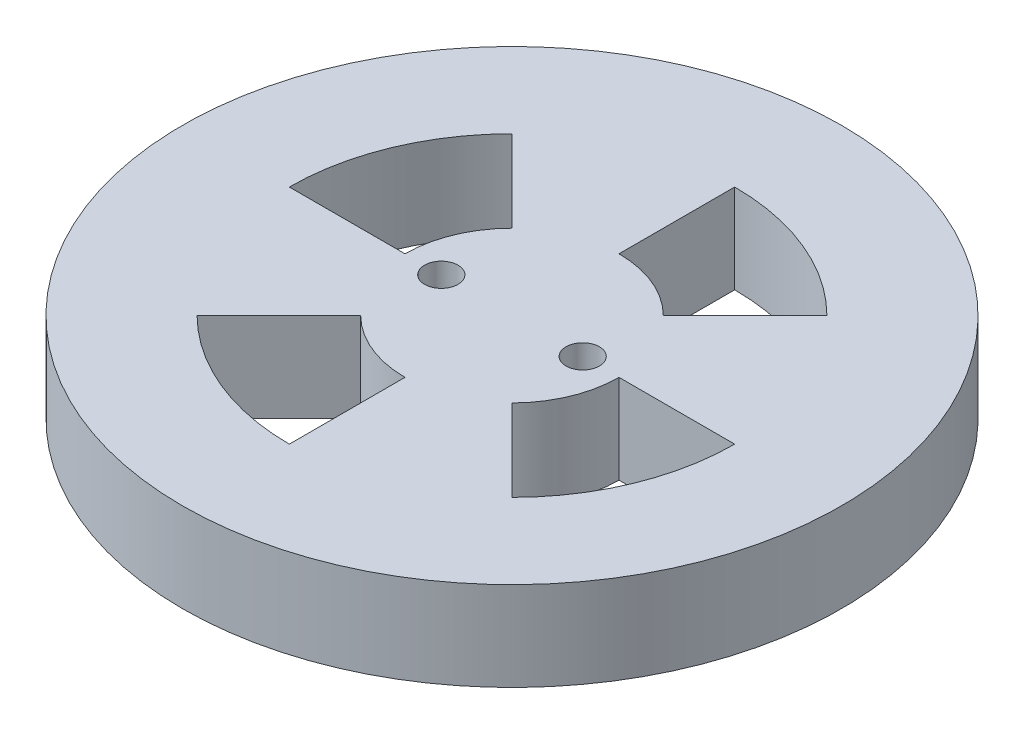
ISO-10303-21;
HEADER;
FILE_DESCRIPTION(('STEP AP214'),'2;1');
FILE_NAME('part.step','',(''),(''),'','','');
FILE_SCHEMA(('AUTOMOTIVE_DESIGN { 1 0 10303 214 1 1 1 1 }'));
ENDSEC;
DATA;
#1=APPLICATION_CONTEXT('core data for automotive mechanical design processes');
#2=APPLICATION_PROTOCOL_DEFINITION('international standard','automotive_design',2000,#1);
#3=PRODUCT_CONTEXT('',#1,'mechanical');
#4=PRODUCT('Part','Part','',(#3));
#5=PRODUCT_RELATED_PRODUCT_CATEGORY('part','',(#4));
#6=PRODUCT_DEFINITION_FORMATION('','',#4);
#7=PRODUCT_DEFINITION_CONTEXT('part definition',#1,'design');
#8=PRODUCT_DEFINITION('design','',#6,#7);
#9=PRODUCT_DEFINITION_SHAPE('','',#8);
#10=(LENGTH_UNIT() NAMED_UNIT(*) SI_UNIT(.MILLI.,.METRE.));
#11=(NAMED_UNIT(*) PLANE_ANGLE_UNIT() SI_UNIT($,.RADIAN.));
#12=(NAMED_UNIT(*) SI_UNIT($,.STERADIAN.) SOLID_ANGLE_UNIT());
#13=UNCERTAINTY_MEASURE_WITH_UNIT(LENGTH_MEASURE(1.E-05),#10,'distance_accuracy_value','');
#14=(GEOMETRIC_REPRESENTATION_CONTEXT(3) GLOBAL_UNCERTAINTY_ASSIGNED_CONTEXT((#13)) GLOBAL_UNIT_ASSIGNED_CONTEXT((#10,
#11,#12)) REPRESENTATION_CONTEXT('',''));
#15=CARTESIAN_POINT('',(0.,0.,0.));
#16=DIRECTION('',(0.,0.,1.));
#17=DIRECTION('',(1.,0.,0.));
#18=AXIS2_PLACEMENT_3D('',#15,#16,#17);
#19=CARTESIAN_POINT('',(-36.4415076331923,8.,-11.9379592869109));
#20=DIRECTION('',(0.,1.,0.));
#21=DIRECTION('',(0.,0.,1.));
#22=AXIS2_PLACEMENT_3D('',#19,#20,#21);
#23=PLANE('',#22);
#24=CARTESIAN_POINT('',(-42.7915076331923,8.,-11.9379592869109));
#25=DIRECTION('',(0.,1.,0.));
#26=DIRECTION('',(0.,0.,1.));
#27=AXIS2_PLACEMENT_3D('',#24,#25,#26);
#28=CIRCLE('',#27,1.5);
#29=CARTESIAN_POINT('',(-42.7915076331923,8.,-10.4379592869109));
#30=VERTEX_POINT('',#29);
#31=EDGE_CURVE('E381',#30,#30,#28,.T.);
#32=ORIENTED_EDGE('',*,*,#31,.F.);
#33=EDGE_LOOP('',(#32));
#34=FACE_BOUND('',#33,.T.);
#35=CARTESIAN_POINT('',(-30.0915076331923,8.,-11.9379592869109));
#36=DIRECTION('',(0.,1.,0.));
#37=DIRECTION('',(0.,0.,1.));
#38=AXIS2_PLACEMENT_3D('',#35,#36,#37);
#39=CIRCLE('',#38,1.5);
#40=CARTESIAN_POINT('',(-30.0915076331923,8.,-10.4379592869109));
#41=VERTEX_POINT('',#40);
#42=EDGE_CURVE('E173',#41,#41,#39,.T.);
#43=ORIENTED_EDGE('',*,*,#42,.F.);
#44=EDGE_LOOP('',(#43));
#45=FACE_BOUND('',#44,.T.);
#46=CARTESIAN_POINT('',(-36.4415076331923,8.,-11.9379592869109));
#47=DIRECTION('',(0.,1.,0.));
#48=DIRECTION('',(0.,0.,1.));
#49=AXIS2_PLACEMENT_3D('',#46,#47,#48);
#50=CIRCLE('',#49,29.6);
#51=CARTESIAN_POINT('',(-36.4415076331923,8.,17.6620407130891));
#52=VERTEX_POINT('',#51);
#53=EDGE_CURVE('E11',#52,#52,#50,.T.);
#54=ORIENTED_EDGE('',*,*,#53,.T.);
#55=EDGE_LOOP('',(#54));
#56=FACE_BOUND('',#55,.T.);
#57=DIRECTION('',(-0.707106781186549,0.,-0.707106781186546));
#58=VECTOR('',#57,1.);
#59=CARTESIAN_POINT('',(-12.2517741731406,8.,12.2517741731407));
#60=LINE('',#59,#58);
#61=CARTESIAN_POINT('',(-43.2375109071762,8.,-18.7339625608948));
#62=VERTEX_POINT('',#61);
#63=CARTESIAN_POINT('',(-50.5836432569233,8.,-26.0800949106418));
#64=VERTEX_POINT('',#63);
#65=EDGE_CURVE('E264',#62,#64,#60,.T.);
#66=ORIENTED_EDGE('',*,*,#65,.F.);
#67=CARTESIAN_POINT('',(-36.4415076331923,8.,-11.9379592869109));
#68=DIRECTION('',(0.,1.,0.));
#69=DIRECTION('',(0.,0.,1.));
#70=AXIS2_PLACEMENT_3D('',#67,#68,#69);
#71=CIRCLE('',#70,9.611);
#72=CARTESIAN_POINT('',(-46.0525076331923,8.,-11.9379592869109));
#73=VERTEX_POINT('',#72);
#74=EDGE_CURVE('E186',#62,#73,#71,.T.);
#75=ORIENTED_EDGE('',*,*,#74,.T.);
#76=DIRECTION('',(-1.,0.,0.));
#77=VECTOR('',#76,1.);
#78=CARTESIAN_POINT('',(0.,8.,-11.9379592869109));
#79=LINE('',#78,#77);
#80=CARTESIAN_POINT('',(-56.4415076331923,8.,-11.9379592869109));
#81=VERTEX_POINT('',#80);
#82=EDGE_CURVE('E253',#73,#81,#79,.T.);
#83=ORIENTED_EDGE('',*,*,#82,.T.);
#84=CARTESIAN_POINT('',(-36.4415076331923,8.,-11.9379592869109));
#85=DIRECTION('',(0.,1.,0.));
#86=DIRECTION('',(0.,0.,1.));
#87=AXIS2_PLACEMENT_3D('',#84,#85,#86);
#88=CIRCLE('',#87,20.);
#89=EDGE_CURVE('E267',#64,#81,#88,.T.);
#90=ORIENTED_EDGE('',*,*,#89,.F.);
#91=EDGE_LOOP('',(#66,#75,#83,#90));
#92=FACE_BOUND('',#91,.T.);
#93=DIRECTION('',(-0.707106781186549,0.,0.707106781186546));
#94=VECTOR('',#93,1.);
#95=CARTESIAN_POINT('',(-24.1897334600515,8.,-24.1897334600516));
#96=LINE('',#95,#94);
#97=CARTESIAN_POINT('',(-43.2375109071762,8.,-5.14195601292698));
#98=VERTEX_POINT('',#97);
#99=CARTESIAN_POINT('',(-50.5836432569233,8.,2.20417633682005));
#100=VERTEX_POINT('',#99);
#101=EDGE_CURVE('E233',#98,#100,#96,.T.);
#102=ORIENTED_EDGE('',*,*,#101,.F.);
#103=CARTESIAN_POINT('',(-36.4415076331923,8.,-11.9379592869109));
#104=DIRECTION('',(0.,1.,0.));
#105=DIRECTION('',(0.,0.,1.));
#106=AXIS2_PLACEMENT_3D('',#103,#104,#105);
#107=CIRCLE('',#106,9.611);
#108=CARTESIAN_POINT('',(-36.4415076331923,8.,-2.32695928691088));
#109=VERTEX_POINT('',#108);
#110=EDGE_CURVE('E230',#98,#109,#107,.T.);
#111=ORIENTED_EDGE('',*,*,#110,.T.);
#112=DIRECTION('',(0.,0.,1.));
#113=VECTOR('',#112,1.);
#114=CARTESIAN_POINT('',(-36.4415076331923,8.,0.));
#115=LINE('',#114,#113);
#116=CARTESIAN_POINT('',(-36.4415076331923,8.,8.06204071308912));
#117=VERTEX_POINT('',#116);
#118=EDGE_CURVE('E221',#109,#117,#115,.T.);
#119=ORIENTED_EDGE('',*,*,#118,.T.);
#120=CARTESIAN_POINT('',(-36.4415076331923,8.,-11.9379592869109));
#121=DIRECTION('',(0.,1.,0.));
#122=DIRECTION('',(0.,0.,1.));
#123=AXIS2_PLACEMENT_3D('',#120,#121,#122);
#124=CIRCLE('',#123,20.);
#125=EDGE_CURVE('E237',#100,#117,#124,.T.);
#126=ORIENTED_EDGE('',*,*,#125,.F.);
#127=EDGE_LOOP('',(#102,#111,#119,#126));
#128=FACE_BOUND('',#127,.T.);
#129=DIRECTION('',(0.707106781186546,0.,0.707106781186549));
#130=VECTOR('',#129,1.);
#131=CARTESIAN_POINT('',(-12.2517741731408,8.,12.2517741731407));
#132=LINE('',#131,#130);
#133=CARTESIAN_POINT('',(-29.6455043592084,8.,-5.14195601292696));
#134=VERTEX_POINT('',#133);
#135=CARTESIAN_POINT('',(-22.2993720094614,8.,2.2041763368201));
#136=VERTEX_POINT('',#135);
#137=EDGE_CURVE('E203',#134,#136,#132,.T.);
#138=ORIENTED_EDGE('',*,*,#137,.F.);
#139=CARTESIAN_POINT('',(-36.4415076331923,8.,-11.9379592869109));
#140=DIRECTION('',(0.,1.,0.));
#141=DIRECTION('',(0.,0.,1.));
#142=AXIS2_PLACEMENT_3D('',#139,#140,#141);
#143=CIRCLE('',#142,9.611);
#144=CARTESIAN_POINT('',(-26.8305076331923,8.,-11.9379592869109));
#145=VERTEX_POINT('',#144);
#146=EDGE_CURVE('E56',#134,#145,#143,.T.);
#147=ORIENTED_EDGE('',*,*,#146,.T.);
#148=DIRECTION('',(1.,0.,0.));
#149=VECTOR('',#148,1.);
#150=CARTESIAN_POINT('',(0.,8.,-11.9379592869109));
#151=LINE('',#150,#149);
#152=CARTESIAN_POINT('',(-16.4415076331923,8.,-11.9379592869109));
#153=VERTEX_POINT('',#152);
#154=EDGE_CURVE('E193',#145,#153,#151,.T.);
#155=ORIENTED_EDGE('',*,*,#154,.T.);
#156=CARTESIAN_POINT('',(-36.4415076331923,8.,-11.9379592869109));
#157=DIRECTION('',(0.,1.,0.));
#158=DIRECTION('',(0.,0.,1.));
#159=AXIS2_PLACEMENT_3D('',#156,#157,#158);
#160=CIRCLE('',#159,20.);
#161=EDGE_CURVE('E207',#136,#153,#160,.T.);
#162=ORIENTED_EDGE('',*,*,#161,.F.);
#163=EDGE_LOOP('',(#138,#147,#155,#162));
#164=FACE_BOUND('',#163,.T.);
#165=DIRECTION('',(0.707106781186549,0.,-0.707106781186546));
#166=VECTOR('',#165,1.);
#167=CARTESIAN_POINT('',(-24.1897334600515,8.,-24.1897334600516));
#168=LINE('',#167,#166);
#169=CARTESIAN_POINT('',(-29.6455043592084,8.,-18.7339625608948));
#170=VERTEX_POINT('',#169);
#171=CARTESIAN_POINT('',(-22.2993720094613,8.,-26.0800949106418));
#172=VERTEX_POINT('',#171);
#173=EDGE_CURVE('E179',#170,#172,#168,.T.);
#174=ORIENTED_EDGE('',*,*,#173,.F.);
#175=CARTESIAN_POINT('',(-36.4415076331923,8.,-11.9379592869109));
#176=DIRECTION('',(0.,1.,0.));
#177=DIRECTION('',(0.,0.,1.));
#178=AXIS2_PLACEMENT_3D('',#175,#176,#177);
#179=CIRCLE('',#178,9.611);
#180=CARTESIAN_POINT('',(-36.4415076331923,8.,-21.5489592869109));
#181=VERTEX_POINT('',#180);
#182=EDGE_CURVE('E48',#170,#181,#179,.T.);
#183=ORIENTED_EDGE('',*,*,#182,.T.);
#184=DIRECTION('',(0.,0.,-1.));
#185=VECTOR('',#184,1.);
#186=CARTESIAN_POINT('',(-36.4415076331923,8.,0.));
#187=LINE('',#186,#185);
#188=CARTESIAN_POINT('',(-36.4415076331923,8.,-31.9379592869109));
#189=VERTEX_POINT('',#188);
#190=EDGE_CURVE('E167',#181,#189,#187,.T.);
#191=ORIENTED_EDGE('',*,*,#190,.T.);
#192=CARTESIAN_POINT('',(-36.4415076331923,8.,-11.9379592869109));
#193=DIRECTION('',(0.,1.,0.));
#194=DIRECTION('',(0.,0.,1.));
#195=AXIS2_PLACEMENT_3D('',#192,#193,#194);
#196=CIRCLE('',#195,20.);
#197=EDGE_CURVE('E170',#172,#189,#196,.T.);
#198=ORIENTED_EDGE('',*,*,#197,.F.);
#199=EDGE_LOOP('',(#174,#183,#191,#198));
#200=FACE_BOUND('',#199,.T.);
#201=ADVANCED_FACE('F33',(#34,#45,#56,#92,#128,#164,#200),#23,.T.);
#202=CARTESIAN_POINT('',(-36.4415076331923,0.,-11.9379592869109));
#203=DIRECTION('',(0.,1.,0.));
#204=DIRECTION('',(0.,0.,1.));
#205=AXIS2_PLACEMENT_3D('',#202,#203,#204);
#206=PLANE('',#205);
#207=CARTESIAN_POINT('',(-42.7915076331923,0.,-11.9379592869109));
#208=DIRECTION('',(0.,1.,0.));
#209=DIRECTION('',(0.,0.,1.));
#210=AXIS2_PLACEMENT_3D('',#207,#208,#209);
#211=CIRCLE('',#210,1.5);
#212=CARTESIAN_POINT('',(-42.7915076331923,0.,-10.4379592869109));
#213=VERTEX_POINT('',#212);
#214=EDGE_CURVE('E379',#213,#213,#211,.T.);
#215=ORIENTED_EDGE('',*,*,#214,.T.);
#216=EDGE_LOOP('',(#215));
#217=FACE_BOUND('',#216,.T.);
#218=CARTESIAN_POINT('',(-30.0915076331923,0.,-11.9379592869109));
#219=DIRECTION('',(0.,1.,0.));
#220=DIRECTION('',(0.,0.,1.));
#221=AXIS2_PLACEMENT_3D('',#218,#219,#220);
#222=CIRCLE('',#221,1.5);
#223=CARTESIAN_POINT('',(-30.0915076331923,0.,-10.4379592869109));
#224=VERTEX_POINT('',#223);
#225=EDGE_CURVE('E234',#224,#224,#222,.T.);
#226=ORIENTED_EDGE('',*,*,#225,.T.);
#227=EDGE_LOOP('',(#226));
#228=FACE_BOUND('',#227,.T.);
#229=CARTESIAN_POINT('',(-36.4415076331923,0.,-11.9379592869109));
#230=DIRECTION('',(0.,1.,0.));
#231=DIRECTION('',(0.,0.,1.));
#232=AXIS2_PLACEMENT_3D('',#229,#230,#231);
#233=CIRCLE('',#232,9.611);
#234=CARTESIAN_POINT('',(-29.6455043592084,0.,-5.14195601292696));
#235=VERTEX_POINT('',#234);
#236=CARTESIAN_POINT('',(-26.8305076331923,0.,-11.9379592869109));
#237=VERTEX_POINT('',#236);
#238=EDGE_CURVE('E190',#235,#237,#233,.T.);
#239=ORIENTED_EDGE('',*,*,#238,.F.);
#240=DIRECTION('',(0.707106781186546,0.,0.707106781186549));
#241=VECTOR('',#240,1.);
#242=CARTESIAN_POINT('',(-12.2517741731408,0.,12.2517741731407));
#243=LINE('',#242,#241);
#244=CARTESIAN_POINT('',(-22.2993720094614,0.,2.2041763368201));
#245=VERTEX_POINT('',#244);
#246=EDGE_CURVE('E192',#235,#245,#243,.T.);
#247=ORIENTED_EDGE('',*,*,#246,.T.);
#248=CARTESIAN_POINT('',(-36.4415076331923,0.,-11.9379592869109));
#249=DIRECTION('',(0.,1.,0.));
#250=DIRECTION('',(0.,0.,1.));
#251=AXIS2_PLACEMENT_3D('',#248,#249,#250);
#252=CIRCLE('',#251,20.);
#253=CARTESIAN_POINT('',(-16.4415076331923,0.,-11.9379592869109));
#254=VERTEX_POINT('',#253);
#255=EDGE_CURVE('E196',#245,#254,#252,.T.);
#256=ORIENTED_EDGE('',*,*,#255,.T.);
#257=DIRECTION('',(1.,0.,0.));
#258=VECTOR('',#257,1.);
#259=CARTESIAN_POINT('',(0.,0.,-11.9379592869109));
#260=LINE('',#259,#258);
#261=EDGE_CURVE('E199',#237,#254,#260,.T.);
#262=ORIENTED_EDGE('',*,*,#261,.F.);
#263=EDGE_LOOP('',(#239,#247,#256,#262));
#264=FACE_BOUND('',#263,.T.);
#265=CARTESIAN_POINT('',(-36.4415076331923,0.,-11.9379592869109));
#266=DIRECTION('',(0.,1.,0.));
#267=DIRECTION('',(0.,0.,1.));
#268=AXIS2_PLACEMENT_3D('',#265,#266,#267);
#269=CIRCLE('',#268,9.611);
#270=CARTESIAN_POINT('',(-43.2375109071762,0.,-18.7339625608948));
#271=VERTEX_POINT('',#270);
#272=CARTESIAN_POINT('',(-46.0525076331923,0.,-11.9379592869109));
#273=VERTEX_POINT('',#272);
#274=EDGE_CURVE('E250',#271,#273,#269,.T.);
#275=ORIENTED_EDGE('',*,*,#274,.F.);
#276=DIRECTION('',(-0.707106781186549,0.,-0.707106781186546));
#277=VECTOR('',#276,1.);
#278=CARTESIAN_POINT('',(-12.2517741731406,0.,12.2517741731407));
#279=LINE('',#278,#277);
#280=CARTESIAN_POINT('',(-50.5836432569233,0.,-26.0800949106418));
#281=VERTEX_POINT('',#280);
#282=EDGE_CURVE('E252',#271,#281,#279,.T.);
#283=ORIENTED_EDGE('',*,*,#282,.T.);
#284=CARTESIAN_POINT('',(-36.4415076331923,0.,-11.9379592869109));
#285=DIRECTION('',(0.,1.,0.));
#286=DIRECTION('',(0.,0.,1.));
#287=AXIS2_PLACEMENT_3D('',#284,#285,#286);
#288=CIRCLE('',#287,20.);
#289=CARTESIAN_POINT('',(-56.4415076331923,0.,-11.9379592869109));
#290=VERTEX_POINT('',#289);
#291=EDGE_CURVE('E256',#281,#290,#288,.T.);
#292=ORIENTED_EDGE('',*,*,#291,.T.);
#293=DIRECTION('',(-1.,0.,0.));
#294=VECTOR('',#293,1.);
#295=CARTESIAN_POINT('',(0.,0.,-11.9379592869109));
#296=LINE('',#295,#294);
#297=EDGE_CURVE('E259',#273,#290,#296,.T.);
#298=ORIENTED_EDGE('',*,*,#297,.F.);
#299=EDGE_LOOP('',(#275,#283,#292,#298));
#300=FACE_BOUND('',#299,.T.);
#301=CARTESIAN_POINT('',(-36.4415076331923,0.,-11.9379592869109));
#302=DIRECTION('',(0.,1.,0.));
#303=DIRECTION('',(0.,0.,1.));
#304=AXIS2_PLACEMENT_3D('',#301,#302,#303);
#305=CIRCLE('',#304,29.6);
#306=CARTESIAN_POINT('',(-36.4415076331923,0.,17.6620407130891));
#307=VERTEX_POINT('',#306);
#308=EDGE_CURVE('E37',#307,#307,#305,.T.);
#309=ORIENTED_EDGE('',*,*,#308,.F.);
#310=EDGE_LOOP('',(#309));
#311=FACE_BOUND('',#310,.T.);
#312=CARTESIAN_POINT('',(-36.4415076331923,0.,-11.9379592869109));
#313=DIRECTION('',(0.,1.,0.));
#314=DIRECTION('',(0.,0.,1.));
#315=AXIS2_PLACEMENT_3D('',#312,#313,#314);
#316=CIRCLE('',#315,9.611);
#317=CARTESIAN_POINT('',(-43.2375109071762,0.,-5.14195601292698));
#318=VERTEX_POINT('',#317);
#319=CARTESIAN_POINT('',(-36.4415076331923,0.,-2.32695928691088));
#320=VERTEX_POINT('',#319);
#321=EDGE_CURVE('E218',#318,#320,#316,.T.);
#322=ORIENTED_EDGE('',*,*,#321,.F.);
#323=DIRECTION('',(-0.707106781186549,0.,0.707106781186546));
#324=VECTOR('',#323,1.);
#325=CARTESIAN_POINT('',(-24.1897334600515,0.,-24.1897334600516));
#326=LINE('',#325,#324);
#327=CARTESIAN_POINT('',(-50.5836432569233,0.,2.20417633682005));
#328=VERTEX_POINT('',#327);
#329=EDGE_CURVE('E220',#318,#328,#326,.T.);
#330=ORIENTED_EDGE('',*,*,#329,.T.);
#331=CARTESIAN_POINT('',(-36.4415076331923,0.,-11.9379592869109));
#332=DIRECTION('',(0.,1.,0.));
#333=DIRECTION('',(0.,0.,1.));
#334=AXIS2_PLACEMENT_3D('',#331,#332,#333);
#335=CIRCLE('',#334,20.);
#336=CARTESIAN_POINT('',(-36.4415076331923,0.,8.06204071308912));
#337=VERTEX_POINT('',#336);
#338=EDGE_CURVE('E224',#328,#337,#335,.T.);
#339=ORIENTED_EDGE('',*,*,#338,.T.);
#340=DIRECTION('',(0.,0.,1.));
#341=VECTOR('',#340,1.);
#342=CARTESIAN_POINT('',(-36.4415076331923,0.,0.));
#343=LINE('',#342,#341);
#344=EDGE_CURVE('E227',#320,#337,#343,.T.);
#345=ORIENTED_EDGE('',*,*,#344,.F.);
#346=EDGE_LOOP('',(#322,#330,#339,#345));
#347=FACE_BOUND('',#346,.T.);
#348=CARTESIAN_POINT('',(-36.4415076331923,0.,-11.9379592869109));
#349=DIRECTION('',(0.,1.,0.));
#350=DIRECTION('',(0.,0.,1.));
#351=AXIS2_PLACEMENT_3D('',#348,#349,#350);
#352=CIRCLE('',#351,9.611);
#353=CARTESIAN_POINT('',(-29.6455043592084,0.,-18.7339625608948));
#354=VERTEX_POINT('',#353);
#355=CARTESIAN_POINT('',(-36.4415076331923,0.,-21.5489592869109));
#356=VERTEX_POINT('',#355);
#357=EDGE_CURVE('E149',#354,#356,#352,.T.);
#358=ORIENTED_EDGE('',*,*,#357,.F.);
#359=DIRECTION('',(0.707106781186549,0.,-0.707106781186546));
#360=VECTOR('',#359,1.);
#361=CARTESIAN_POINT('',(-24.1897334600515,0.,-24.1897334600516));
#362=LINE('',#361,#360);
#363=CARTESIAN_POINT('',(-22.2993720094613,0.,-26.0800949106418));
#364=VERTEX_POINT('',#363);
#365=EDGE_CURVE('E159',#354,#364,#362,.T.);
#366=ORIENTED_EDGE('',*,*,#365,.T.);
#367=CARTESIAN_POINT('',(-36.4415076331923,0.,-11.9379592869109));
#368=DIRECTION('',(0.,1.,0.));
#369=DIRECTION('',(0.,0.,1.));
#370=AXIS2_PLACEMENT_3D('',#367,#368,#369);
#371=CIRCLE('',#370,20.);
#372=CARTESIAN_POINT('',(-36.4415076331923,0.,-31.9379592869109));
#373=VERTEX_POINT('',#372);
#374=EDGE_CURVE('E163',#364,#373,#371,.T.);
#375=ORIENTED_EDGE('',*,*,#374,.T.);
#376=DIRECTION('',(0.,0.,-1.));
#377=VECTOR('',#376,1.);
#378=CARTESIAN_POINT('',(-36.4415076331923,0.,0.));
#379=LINE('',#378,#377);
#380=EDGE_CURVE('E155',#356,#373,#379,.T.);
#381=ORIENTED_EDGE('',*,*,#380,.F.);
#382=EDGE_LOOP('',(#358,#366,#375,#381));
#383=FACE_BOUND('',#382,.T.);
#384=ADVANCED_FACE('F166',(#217,#228,#264,#300,#311,#347,#383),#206,.F.);
#385=CARTESIAN_POINT('',(-36.4415076331923,8.,-11.9379592869109));
#386=DIRECTION('',(0.,-1.,0.));
#387=DIRECTION('',(0.,0.,-1.));
#388=AXIS2_PLACEMENT_3D('',#385,#386,#387);
#389=CYLINDRICAL_SURFACE('',#388,29.6);
#390=ORIENTED_EDGE('',*,*,#53,.F.);
#391=EDGE_LOOP('',(#390));
#392=FACE_BOUND('',#391,.T.);
#393=ORIENTED_EDGE('',*,*,#308,.T.);
#394=EDGE_LOOP('',(#393));
#395=FACE_BOUND('',#394,.T.);
#396=ADVANCED_FACE('F35',(#392,#395),#389,.T.);
#397=CARTESIAN_POINT('',(-36.4415076331923,0.,-11.9379592869109));
#398=DIRECTION('',(0.,1.,0.));
#399=DIRECTION('',(0.,0.,1.));
#400=AXIS2_PLACEMENT_3D('',#397,#398,#399);
#401=CYLINDRICAL_SURFACE('',#400,9.611);
#402=ORIENTED_EDGE('',*,*,#74,.F.);
#403=DIRECTION('',(0.,1.,0.));
#404=VECTOR('',#403,1.);
#405=CARTESIAN_POINT('',(-43.2375109071762,0.,-18.7339625608948));
#406=LINE('',#405,#404);
#407=EDGE_CURVE('E261',#271,#62,#406,.T.);
#408=ORIENTED_EDGE('',*,*,#407,.F.);
#409=ORIENTED_EDGE('',*,*,#274,.T.);
#410=DIRECTION('',(0.,1.,0.));
#411=VECTOR('',#410,1.);
#412=CARTESIAN_POINT('',(-46.0525076331923,0.,-11.9379592869109));
#413=LINE('',#412,#411);
#414=EDGE_CURVE('E272',#273,#73,#413,.T.);
#415=ORIENTED_EDGE('',*,*,#414,.T.);
#416=EDGE_LOOP('',(#402,#408,#409,#415));
#417=FACE_BOUND('',#416,.T.);
#418=ADVANCED_FACE('F297',(#417),#401,.T.);
#419=CARTESIAN_POINT('',(0.,0.,-11.9379592869109));
#420=DIRECTION('',(0.,0.,-1.));
#421=DIRECTION('',(-1.,0.,0.));
#422=AXIS2_PLACEMENT_3D('',#419,#420,#421);
#423=PLANE('',#422);
#424=ORIENTED_EDGE('',*,*,#82,.F.);
#425=ORIENTED_EDGE('',*,*,#414,.F.);
#426=ORIENTED_EDGE('',*,*,#297,.T.);
#427=DIRECTION('',(0.,1.,0.));
#428=VECTOR('',#427,1.);
#429=CARTESIAN_POINT('',(-56.4415076331923,0.,-11.9379592869109));
#430=LINE('',#429,#428);
#431=EDGE_CURVE('E275',#290,#81,#430,.T.);
#432=ORIENTED_EDGE('',*,*,#431,.T.);
#433=EDGE_LOOP('',(#424,#425,#426,#432));
#434=FACE_BOUND('',#433,.T.);
#435=ADVANCED_FACE('F299',(#434),#423,.T.);
#436=CARTESIAN_POINT('',(-36.4415076331923,0.,-11.9379592869109));
#437=DIRECTION('',(0.,1.,0.));
#438=DIRECTION('',(0.,0.,1.));
#439=AXIS2_PLACEMENT_3D('',#436,#437,#438);
#440=CYLINDRICAL_SURFACE('',#439,20.);
#441=ORIENTED_EDGE('',*,*,#89,.T.);
#442=ORIENTED_EDGE('',*,*,#431,.F.);
#443=ORIENTED_EDGE('',*,*,#291,.F.);
#444=DIRECTION('',(0.,1.,0.));
#445=VECTOR('',#444,1.);
#446=CARTESIAN_POINT('',(-50.5836432569233,0.,-26.0800949106418));
#447=LINE('',#446,#445);
#448=EDGE_CURVE('E277',#281,#64,#447,.T.);
#449=ORIENTED_EDGE('',*,*,#448,.T.);
#450=EDGE_LOOP('',(#441,#442,#443,#449));
#451=FACE_BOUND('',#450,.T.);
#452=ADVANCED_FACE('F292',(#451),#440,.F.);
#453=CARTESIAN_POINT('',(-12.2517741731406,0.,12.2517741731407));
#454=DIRECTION('',(0.707106781186546,0.,-0.707106781186549));
#455=DIRECTION('',(-0.707106781186549,0.,-0.707106781186546));
#456=AXIS2_PLACEMENT_3D('',#453,#454,#455);
#457=PLANE('',#456);
#458=ORIENTED_EDGE('',*,*,#65,.T.);
#459=ORIENTED_EDGE('',*,*,#448,.F.);
#460=ORIENTED_EDGE('',*,*,#282,.F.);
#461=ORIENTED_EDGE('',*,*,#407,.T.);
#462=EDGE_LOOP('',(#458,#459,#460,#461));
#463=FACE_BOUND('',#462,.T.);
#464=ADVANCED_FACE('F283',(#463),#457,.F.);
#465=CARTESIAN_POINT('',(-36.4415076331923,0.,-11.9379592869109));
#466=DIRECTION('',(0.,1.,0.));
#467=DIRECTION('',(0.,0.,1.));
#468=AXIS2_PLACEMENT_3D('',#465,#466,#467);
#469=CYLINDRICAL_SURFACE('',#468,9.611);
#470=ORIENTED_EDGE('',*,*,#110,.F.);
#471=DIRECTION('',(0.,1.,0.));
#472=VECTOR('',#471,1.);
#473=CARTESIAN_POINT('',(-43.2375109071762,0.,-5.14195601292698));
#474=LINE('',#473,#472);
#475=EDGE_CURVE('E229',#318,#98,#474,.T.);
#476=ORIENTED_EDGE('',*,*,#475,.F.);
#477=ORIENTED_EDGE('',*,*,#321,.T.);
#478=DIRECTION('',(0.,1.,0.));
#479=VECTOR('',#478,1.);
#480=CARTESIAN_POINT('',(-36.4415076331923,0.,-2.32695928691088));
#481=LINE('',#480,#479);
#482=EDGE_CURVE('E204',#320,#109,#481,.T.);
#483=ORIENTED_EDGE('',*,*,#482,.T.);
#484=EDGE_LOOP('',(#470,#476,#477,#483));
#485=FACE_BOUND('',#484,.T.);
#486=ADVANCED_FACE('F320',(#485),#469,.T.);
#487=CARTESIAN_POINT('',(-36.4415076331923,0.,0.));
#488=DIRECTION('',(-1.,0.,0.));
#489=DIRECTION('',(0.,0.,1.));
#490=AXIS2_PLACEMENT_3D('',#487,#488,#489);
#491=PLANE('',#490);
#492=ORIENTED_EDGE('',*,*,#118,.F.);
#493=ORIENTED_EDGE('',*,*,#482,.F.);
#494=ORIENTED_EDGE('',*,*,#344,.T.);
#495=DIRECTION('',(0.,1.,0.));
#496=VECTOR('',#495,1.);
#497=CARTESIAN_POINT('',(-36.4415076331923,0.,8.06204071308912));
#498=LINE('',#497,#496);
#499=EDGE_CURVE('E244',#337,#117,#498,.T.);
#500=ORIENTED_EDGE('',*,*,#499,.T.);
#501=EDGE_LOOP('',(#492,#493,#494,#500));
#502=FACE_BOUND('',#501,.T.);
#503=ADVANCED_FACE('F324',(#502),#491,.T.);
#504=CARTESIAN_POINT('',(-36.4415076331923,0.,-11.9379592869109));
#505=DIRECTION('',(0.,1.,0.));
#506=DIRECTION('',(0.,0.,1.));
#507=AXIS2_PLACEMENT_3D('',#504,#505,#506);
#508=CYLINDRICAL_SURFACE('',#507,20.);
#509=ORIENTED_EDGE('',*,*,#125,.T.);
#510=ORIENTED_EDGE('',*,*,#499,.F.);
#511=ORIENTED_EDGE('',*,*,#338,.F.);
#512=DIRECTION('',(0.,1.,0.));
#513=VECTOR('',#512,1.);
#514=CARTESIAN_POINT('',(-50.5836432569233,0.,2.20417633682005));
#515=LINE('',#514,#513);
#516=EDGE_CURVE('E246',#328,#100,#515,.T.);
#517=ORIENTED_EDGE('',*,*,#516,.T.);
#518=EDGE_LOOP('',(#509,#510,#511,#517));
#519=FACE_BOUND('',#518,.T.);
#520=ADVANCED_FACE('F329',(#519),#508,.F.);
#521=CARTESIAN_POINT('',(-24.1897334600515,0.,-24.1897334600516));
#522=DIRECTION('',(-0.707106781186546,0.,-0.707106781186549));
#523=DIRECTION('',(-0.707106781186549,0.,0.707106781186546));
#524=AXIS2_PLACEMENT_3D('',#521,#522,#523);
#525=PLANE('',#524);
#526=ORIENTED_EDGE('',*,*,#101,.T.);
#527=ORIENTED_EDGE('',*,*,#516,.F.);
#528=ORIENTED_EDGE('',*,*,#329,.F.);
#529=ORIENTED_EDGE('',*,*,#475,.T.);
#530=EDGE_LOOP('',(#526,#527,#528,#529));
#531=FACE_BOUND('',#530,.T.);
#532=ADVANCED_FACE('F333',(#531),#525,.F.);
#533=CARTESIAN_POINT('',(-36.4415076331923,0.,-11.9379592869109));
#534=DIRECTION('',(0.,1.,0.));
#535=DIRECTION('',(0.,0.,1.));
#536=AXIS2_PLACEMENT_3D('',#533,#534,#535);
#537=CYLINDRICAL_SURFACE('',#536,9.611);
#538=ORIENTED_EDGE('',*,*,#146,.F.);
#539=DIRECTION('',(0.,1.,0.));
#540=VECTOR('',#539,1.);
#541=CARTESIAN_POINT('',(-29.6455043592084,0.,-5.14195601292696));
#542=LINE('',#541,#540);
#543=EDGE_CURVE('E201',#235,#134,#542,.T.);
#544=ORIENTED_EDGE('',*,*,#543,.F.);
#545=ORIENTED_EDGE('',*,*,#238,.T.);
#546=DIRECTION('',(0.,1.,0.));
#547=VECTOR('',#546,1.);
#548=CARTESIAN_POINT('',(-26.8305076331923,0.,-11.9379592869109));
#549=LINE('',#548,#547);
#550=EDGE_CURVE('E180',#237,#145,#549,.T.);
#551=ORIENTED_EDGE('',*,*,#550,.T.);
#552=EDGE_LOOP('',(#538,#544,#545,#551));
#553=FACE_BOUND('',#552,.T.);
#554=ADVANCED_FACE('F336',(#553),#537,.T.);
#555=CARTESIAN_POINT('',(0.,0.,-11.9379592869109));
#556=DIRECTION('',(0.,0.,1.));
#557=DIRECTION('',(1.,0.,0.));
#558=AXIS2_PLACEMENT_3D('',#555,#556,#557);
#559=PLANE('',#558);
#560=ORIENTED_EDGE('',*,*,#154,.F.);
#561=ORIENTED_EDGE('',*,*,#550,.F.);
#562=ORIENTED_EDGE('',*,*,#261,.T.);
#563=DIRECTION('',(0.,1.,0.));
#564=VECTOR('',#563,1.);
#565=CARTESIAN_POINT('',(-16.4415076331923,0.,-11.9379592869109));
#566=LINE('',#565,#564);
#567=EDGE_CURVE('E213',#254,#153,#566,.T.);
#568=ORIENTED_EDGE('',*,*,#567,.T.);
#569=EDGE_LOOP('',(#560,#561,#562,#568));
#570=FACE_BOUND('',#569,.T.);
#571=ADVANCED_FACE('F343',(#570),#559,.T.);
#572=CARTESIAN_POINT('',(-36.4415076331923,0.,-11.9379592869109));
#573=DIRECTION('',(0.,1.,0.));
#574=DIRECTION('',(0.,0.,1.));
#575=AXIS2_PLACEMENT_3D('',#572,#573,#574);
#576=CYLINDRICAL_SURFACE('',#575,20.);
#577=ORIENTED_EDGE('',*,*,#161,.T.);
#578=ORIENTED_EDGE('',*,*,#567,.F.);
#579=ORIENTED_EDGE('',*,*,#255,.F.);
#580=DIRECTION('',(0.,1.,0.));
#581=VECTOR('',#580,1.);
#582=CARTESIAN_POINT('',(-22.2993720094614,0.,2.2041763368201));
#583=LINE('',#582,#581);
#584=EDGE_CURVE('E215',#245,#136,#583,.T.);
#585=ORIENTED_EDGE('',*,*,#584,.T.);
#586=EDGE_LOOP('',(#577,#578,#579,#585));
#587=FACE_BOUND('',#586,.T.);
#588=ADVANCED_FACE('F347',(#587),#576,.F.);
#589=CARTESIAN_POINT('',(-12.2517741731408,0.,12.2517741731407));
#590=DIRECTION('',(-0.707106781186549,0.,0.707106781186546));
#591=DIRECTION('',(0.707106781186546,0.,0.707106781186549));
#592=AXIS2_PLACEMENT_3D('',#589,#590,#591);
#593=PLANE('',#592);
#594=ORIENTED_EDGE('',*,*,#137,.T.);
#595=ORIENTED_EDGE('',*,*,#584,.F.);
#596=ORIENTED_EDGE('',*,*,#246,.F.);
#597=ORIENTED_EDGE('',*,*,#543,.T.);
#598=EDGE_LOOP('',(#594,#595,#596,#597));
#599=FACE_BOUND('',#598,.T.);
#600=ADVANCED_FACE('F344',(#599),#593,.F.);
#601=CARTESIAN_POINT('',(-36.4415076331923,0.,-11.9379592869109));
#602=DIRECTION('',(0.,1.,0.));
#603=DIRECTION('',(0.,0.,1.));
#604=AXIS2_PLACEMENT_3D('',#601,#602,#603);
#605=CYLINDRICAL_SURFACE('',#604,9.611);
#606=ORIENTED_EDGE('',*,*,#182,.F.);
#607=DIRECTION('',(0.,1.,0.));
#608=VECTOR('',#607,1.);
#609=CARTESIAN_POINT('',(-29.6455043592084,0.,-18.7339625608948));
#610=LINE('',#609,#608);
#611=EDGE_CURVE('E145',#354,#170,#610,.T.);
#612=ORIENTED_EDGE('',*,*,#611,.F.);
#613=ORIENTED_EDGE('',*,*,#357,.T.);
#614=DIRECTION('',(0.,1.,0.));
#615=VECTOR('',#614,1.);
#616=CARTESIAN_POINT('',(-36.4415076331923,0.,-21.5489592869109));
#617=LINE('',#616,#615);
#618=EDGE_CURVE('E184',#356,#181,#617,.T.);
#619=ORIENTED_EDGE('',*,*,#618,.T.);
#620=EDGE_LOOP('',(#606,#612,#613,#619));
#621=FACE_BOUND('',#620,.T.);
#622=ADVANCED_FACE('F147',(#621),#605,.T.);
#623=CARTESIAN_POINT('',(-36.4415076331923,0.,0.));
#624=DIRECTION('',(1.,0.,0.));
#625=DIRECTION('',(0.,0.,-1.));
#626=AXIS2_PLACEMENT_3D('',#623,#624,#625);
#627=PLANE('',#626);
#628=ORIENTED_EDGE('',*,*,#190,.F.);
#629=ORIENTED_EDGE('',*,*,#618,.F.);
#630=ORIENTED_EDGE('',*,*,#380,.T.);
#631=DIRECTION('',(0.,1.,0.));
#632=VECTOR('',#631,1.);
#633=CARTESIAN_POINT('',(-36.4415076331923,0.,-31.9379592869109));
#634=LINE('',#633,#632);
#635=EDGE_CURVE('E187',#373,#189,#634,.T.);
#636=ORIENTED_EDGE('',*,*,#635,.T.);
#637=EDGE_LOOP('',(#628,#629,#630,#636));
#638=FACE_BOUND('',#637,.T.);
#639=ADVANCED_FACE('F357',(#638),#627,.T.);
#640=CARTESIAN_POINT('',(-36.4415076331923,0.,-11.9379592869109));
#641=DIRECTION('',(0.,1.,0.));
#642=DIRECTION('',(0.,0.,1.));
#643=AXIS2_PLACEMENT_3D('',#640,#641,#642);
#644=CYLINDRICAL_SURFACE('',#643,20.);
#645=ORIENTED_EDGE('',*,*,#197,.T.);
#646=ORIENTED_EDGE('',*,*,#635,.F.);
#647=ORIENTED_EDGE('',*,*,#374,.F.);
#648=DIRECTION('',(0.,1.,0.));
#649=VECTOR('',#648,1.);
#650=CARTESIAN_POINT('',(-22.2993720094613,0.,-26.0800949106418));
#651=LINE('',#650,#649);
#652=EDGE_CURVE('E154',#364,#172,#651,.T.);
#653=ORIENTED_EDGE('',*,*,#652,.T.);
#654=EDGE_LOOP('',(#645,#646,#647,#653));
#655=FACE_BOUND('',#654,.T.);
#656=ADVANCED_FACE('F361',(#655),#644,.F.);
#657=CARTESIAN_POINT('',(-24.1897334600515,0.,-24.1897334600516));
#658=DIRECTION('',(0.707106781186546,0.,0.707106781186549));
#659=DIRECTION('',(0.707106781186549,0.,-0.707106781186546));
#660=AXIS2_PLACEMENT_3D('',#657,#658,#659);
#661=PLANE('',#660);
#662=ORIENTED_EDGE('',*,*,#173,.T.);
#663=ORIENTED_EDGE('',*,*,#652,.F.);
#664=ORIENTED_EDGE('',*,*,#365,.F.);
#665=ORIENTED_EDGE('',*,*,#611,.T.);
#666=EDGE_LOOP('',(#662,#663,#664,#665));
#667=FACE_BOUND('',#666,.T.);
#668=ADVANCED_FACE('F160',(#667),#661,.F.);
#669=CARTESIAN_POINT('',(-30.0915076331923,0.,-11.9379592869109));
#670=DIRECTION('',(0.,1.,0.));
#671=DIRECTION('',(0.,0.,1.));
#672=AXIS2_PLACEMENT_3D('',#669,#670,#671);
#673=CYLINDRICAL_SURFACE('',#672,1.5);
#674=ORIENTED_EDGE('',*,*,#225,.F.);
#675=EDGE_LOOP('',(#674));
#676=FACE_BOUND('',#675,.T.);
#677=ORIENTED_EDGE('',*,*,#42,.T.);
#678=EDGE_LOOP('',(#677));
#679=FACE_BOUND('',#678,.T.);
#680=ADVANCED_FACE('F360',(#676,#679),#673,.F.);
#681=CARTESIAN_POINT('',(-42.7915076331923,0.,-11.9379592869109));
#682=DIRECTION('',(0.,1.,0.));
#683=DIRECTION('',(0.,0.,1.));
#684=AXIS2_PLACEMENT_3D('',#681,#682,#683);
#685=CYLINDRICAL_SURFACE('',#684,1.5);
#686=ORIENTED_EDGE('',*,*,#214,.F.);
#687=EDGE_LOOP('',(#686));
#688=FACE_BOUND('',#687,.T.);
#689=ORIENTED_EDGE('',*,*,#31,.T.);
#690=EDGE_LOOP('',(#689));
#691=FACE_BOUND('',#690,.T.);
#692=ADVANCED_FACE('F370',(#688,#691),#685,.F.);
#693=CLOSED_SHELL('',(#201,#384,#396,#418,#435,#452,#464,#486,#503,#520,#532,#554,#571,#588,
#600,#622,#639,#656,#668,#680,#692));
#694=MANIFOLD_SOLID_BREP('B2',#693);
#695=ADVANCED_BREP_SHAPE_REPRESENTATION('',(#18,#694),#14);
#696=SHAPE_DEFINITION_REPRESENTATION(#9,#695);
ENDSEC;
END-ISO-10303-21;
